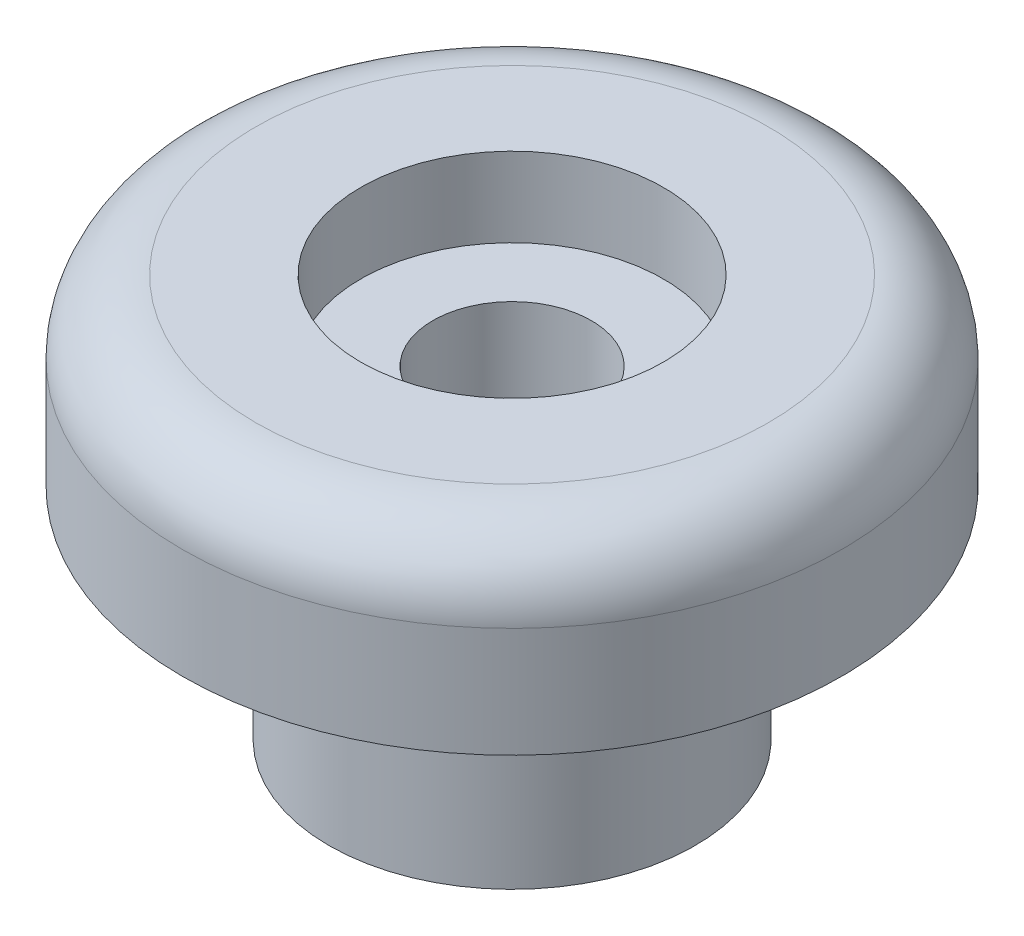
ISO-10303-21;
HEADER;
FILE_DESCRIPTION(('STEP AP214'),'2;1');
FILE_NAME('part.step','',(''),(''),'','','');
FILE_SCHEMA(('AUTOMOTIVE_DESIGN { 1 0 10303 214 1 1 1 1 }'));
ENDSEC;
DATA;
#1=APPLICATION_CONTEXT('core data for automotive mechanical design processes');
#2=APPLICATION_PROTOCOL_DEFINITION('international standard','automotive_design',2000,#1);
#3=PRODUCT_CONTEXT('',#1,'mechanical');
#4=PRODUCT('Part','Part','',(#3));
#5=PRODUCT_RELATED_PRODUCT_CATEGORY('part','',(#4));
#6=PRODUCT_DEFINITION_FORMATION('','',#4);
#7=PRODUCT_DEFINITION_CONTEXT('part definition',#1,'design');
#8=PRODUCT_DEFINITION('design','',#6,#7);
#9=PRODUCT_DEFINITION_SHAPE('','',#8);
#10=(LENGTH_UNIT() NAMED_UNIT(*) SI_UNIT(.MILLI.,.METRE.));
#11=(NAMED_UNIT(*) PLANE_ANGLE_UNIT() SI_UNIT($,.RADIAN.));
#12=(NAMED_UNIT(*) SI_UNIT($,.STERADIAN.) SOLID_ANGLE_UNIT());
#13=UNCERTAINTY_MEASURE_WITH_UNIT(LENGTH_MEASURE(1.E-05),#10,'distance_accuracy_value','');
#14=(GEOMETRIC_REPRESENTATION_CONTEXT(3) GLOBAL_UNCERTAINTY_ASSIGNED_CONTEXT((#13)) GLOBAL_UNIT_ASSIGNED_CONTEXT((#10,
#11,#12)) REPRESENTATION_CONTEXT('',''));
#15=CARTESIAN_POINT('',(0.,0.,0.));
#16=DIRECTION('',(0.,0.,1.));
#17=DIRECTION('',(1.,0.,0.));
#18=AXIS2_PLACEMENT_3D('',#15,#16,#17);
#19=CARTESIAN_POINT('',(0.,8.89,0.));
#20=DIRECTION('',(0.,-1.,0.));
#21=DIRECTION('',(0.,0.,-1.));
#22=AXIS2_PLACEMENT_3D('',#19,#20,#21);
#23=CYLINDRICAL_SURFACE('',#22,6.35);
#24=CARTESIAN_POINT('',(0.,0.,0.));
#25=DIRECTION('',(0.,1.,0.));
#26=DIRECTION('',(0.,0.,1.));
#27=AXIS2_PLACEMENT_3D('',#24,#25,#26);
#28=CIRCLE('',#27,6.35);
#29=CARTESIAN_POINT('',(0.,0.,6.35));
#30=VERTEX_POINT('',#29);
#31=EDGE_CURVE('E54',#30,#30,#28,.T.);
#32=ORIENTED_EDGE('',*,*,#31,.T.);
#33=EDGE_LOOP('',(#32));
#34=FACE_BOUND('',#33,.T.);
#35=CARTESIAN_POINT('',(0.,7.62,0.));
#36=DIRECTION('',(0.,1.,0.));
#37=DIRECTION('',(0.,0.,1.));
#38=AXIS2_PLACEMENT_3D('',#35,#36,#37);
#39=CIRCLE('',#38,6.35);
#40=CARTESIAN_POINT('',(0.,7.62,6.35));
#41=VERTEX_POINT('',#40);
#42=EDGE_CURVE('E50',#41,#41,#39,.T.);
#43=ORIENTED_EDGE('',*,*,#42,.F.);
#44=EDGE_LOOP('',(#43));
#45=FACE_BOUND('',#44,.T.);
#46=ADVANCED_FACE('F39',(#34,#45),#23,.T.);
#47=CARTESIAN_POINT('',(0.,0.,0.));
#48=DIRECTION('',(0.,1.,0.));
#49=DIRECTION('',(0.,0.,1.));
#50=AXIS2_PLACEMENT_3D('',#47,#48,#49);
#51=PLANE('',#50);
#52=CARTESIAN_POINT('',(0.,0.,0.));
#53=DIRECTION('',(0.,1.,0.));
#54=DIRECTION('',(0.,0.,1.));
#55=AXIS2_PLACEMENT_3D('',#52,#53,#54);
#56=CIRCLE('',#55,2.75);
#57=CARTESIAN_POINT('',(0.,0.,2.75));
#58=VERTEX_POINT('',#57);
#59=EDGE_CURVE('E62',#58,#58,#56,.T.);
#60=ORIENTED_EDGE('',*,*,#59,.T.);
#61=EDGE_LOOP('',(#60));
#62=FACE_BOUND('',#61,.T.);
#63=ORIENTED_EDGE('',*,*,#31,.F.);
#64=EDGE_LOOP('',(#63));
#65=FACE_BOUND('',#64,.T.);
#66=ADVANCED_FACE('F95',(#62,#65),#51,.F.);
#67=CARTESIAN_POINT('',(0.,7.62,0.));
#68=DIRECTION('',(0.,1.,0.));
#69=DIRECTION('',(0.,0.,1.));
#70=AXIS2_PLACEMENT_3D('',#67,#68,#69);
#71=CYLINDRICAL_SURFACE('',#70,11.43);
#72=CARTESIAN_POINT('',(0.,11.43,0.));
#73=DIRECTION('',(0.,1.,0.));
#74=DIRECTION('',(0.,0.,1.));
#75=AXIS2_PLACEMENT_3D('',#72,#73,#74);
#76=CIRCLE('',#75,11.43);
#77=CARTESIAN_POINT('',(0.,11.43,11.43));
#78=VERTEX_POINT('',#77);
#79=EDGE_CURVE('E10',#78,#78,#76,.F.);
#80=ORIENTED_EDGE('',*,*,#79,.T.);
#81=EDGE_LOOP('',(#80));
#82=FACE_BOUND('',#81,.T.);
#83=CARTESIAN_POINT('',(0.,7.62,0.));
#84=DIRECTION('',(0.,1.,0.));
#85=DIRECTION('',(0.,0.,1.));
#86=AXIS2_PLACEMENT_3D('',#83,#84,#85);
#87=CIRCLE('',#86,11.43);
#88=CARTESIAN_POINT('',(0.,7.62,11.43));
#89=VERTEX_POINT('',#88);
#90=EDGE_CURVE('E59',#89,#89,#87,.T.);
#91=ORIENTED_EDGE('',*,*,#90,.T.);
#92=EDGE_LOOP('',(#91));
#93=FACE_BOUND('',#92,.T.);
#94=ADVANCED_FACE('F91',(#82,#93),#71,.T.);
#95=CARTESIAN_POINT('',(0.,7.62,0.));
#96=DIRECTION('',(0.,1.,0.));
#97=DIRECTION('',(0.,0.,1.));
#98=AXIS2_PLACEMENT_3D('',#95,#96,#97);
#99=PLANE('',#98);
#100=ORIENTED_EDGE('',*,*,#42,.T.);
#101=EDGE_LOOP('',(#100));
#102=FACE_BOUND('',#101,.T.);
#103=ORIENTED_EDGE('',*,*,#90,.F.);
#104=EDGE_LOOP('',(#103));
#105=FACE_BOUND('',#104,.T.);
#106=ADVANCED_FACE('F80',(#102,#105),#99,.F.);
#107=CARTESIAN_POINT('',(0.,13.97,0.));
#108=DIRECTION('',(0.,1.,0.));
#109=DIRECTION('',(0.,0.,1.));
#110=AXIS2_PLACEMENT_3D('',#107,#108,#109);
#111=PLANE('',#110);
#112=CARTESIAN_POINT('',(0.,13.97,0.));
#113=DIRECTION('',(0.,1.,0.));
#114=DIRECTION('',(0.,0.,1.));
#115=AXIS2_PLACEMENT_3D('',#112,#113,#114);
#116=CIRCLE('',#115,8.89);
#117=CARTESIAN_POINT('',(0.,13.97,8.89));
#118=VERTEX_POINT('',#117);
#119=EDGE_CURVE('E46',#118,#118,#116,.T.);
#120=ORIENTED_EDGE('',*,*,#119,.T.);
#121=EDGE_LOOP('',(#120));
#122=FACE_BOUND('',#121,.T.);
#123=CARTESIAN_POINT('',(0.,13.97,0.));
#124=DIRECTION('',(0.,1.,0.));
#125=DIRECTION('',(0.,0.,1.));
#126=AXIS2_PLACEMENT_3D('',#123,#124,#125);
#127=CIRCLE('',#126,5.25);
#128=CARTESIAN_POINT('',(0.,13.97,5.25));
#129=VERTEX_POINT('',#128);
#130=EDGE_CURVE('E71',#129,#129,#127,.T.);
#131=ORIENTED_EDGE('',*,*,#130,.F.);
#132=EDGE_LOOP('',(#131));
#133=FACE_BOUND('',#132,.T.);
#134=ADVANCED_FACE('F77',(#122,#133),#111,.T.);
#135=CARTESIAN_POINT('',(0.,13.97,0.));
#136=DIRECTION('',(0.,1.,0.));
#137=DIRECTION('',(0.,0.,1.));
#138=AXIS2_PLACEMENT_3D('',#135,#136,#137);
#139=CYLINDRICAL_SURFACE('',#138,2.75);
#140=ORIENTED_EDGE('',*,*,#59,.F.);
#141=EDGE_LOOP('',(#140));
#142=FACE_BOUND('',#141,.T.);
#143=CARTESIAN_POINT('',(0.,11.22,0.));
#144=DIRECTION('',(0.,1.,0.));
#145=DIRECTION('',(0.,0.,1.));
#146=AXIS2_PLACEMENT_3D('',#143,#144,#145);
#147=CIRCLE('',#146,2.75);
#148=CARTESIAN_POINT('',(0.,11.22,2.75));
#149=VERTEX_POINT('',#148);
#150=EDGE_CURVE('E65',#149,#149,#147,.T.);
#151=ORIENTED_EDGE('',*,*,#150,.T.);
#152=EDGE_LOOP('',(#151));
#153=FACE_BOUND('',#152,.T.);
#154=ADVANCED_FACE('F79',(#142,#153),#139,.F.);
#155=CARTESIAN_POINT('',(2.75,11.22,0.));
#156=DIRECTION('',(0.,-1.,0.));
#157=DIRECTION('',(0.,0.,-1.));
#158=AXIS2_PLACEMENT_3D('',#155,#156,#157);
#159=PLANE('',#158);
#160=ORIENTED_EDGE('',*,*,#150,.F.);
#161=EDGE_LOOP('',(#160));
#162=FACE_BOUND('',#161,.T.);
#163=CARTESIAN_POINT('',(0.,11.22,0.));
#164=DIRECTION('',(0.,1.,0.));
#165=DIRECTION('',(0.,0.,1.));
#166=AXIS2_PLACEMENT_3D('',#163,#164,#165);
#167=CIRCLE('',#166,5.25);
#168=CARTESIAN_POINT('',(0.,11.22,5.25));
#169=VERTEX_POINT('',#168);
#170=EDGE_CURVE('E68',#169,#169,#167,.T.);
#171=ORIENTED_EDGE('',*,*,#170,.T.);
#172=EDGE_LOOP('',(#171));
#173=FACE_BOUND('',#172,.T.);
#174=ADVANCED_FACE('F87',(#162,#173),#159,.F.);
#175=CARTESIAN_POINT('',(0.,13.97,0.));
#176=DIRECTION('',(0.,1.,0.));
#177=DIRECTION('',(0.,0.,1.));
#178=AXIS2_PLACEMENT_3D('',#175,#176,#177);
#179=CYLINDRICAL_SURFACE('',#178,5.25);
#180=ORIENTED_EDGE('',*,*,#170,.F.);
#181=EDGE_LOOP('',(#180));
#182=FACE_BOUND('',#181,.T.);
#183=ORIENTED_EDGE('',*,*,#130,.T.);
#184=EDGE_LOOP('',(#183));
#185=FACE_BOUND('',#184,.T.);
#186=ADVANCED_FACE('F75',(#182,#185),#179,.F.);
#187=CARTESIAN_POINT('',(0.,11.43,0.));
#188=DIRECTION('',(0.,1.,0.));
#189=DIRECTION('',(0.,0.,1.));
#190=AXIS2_PLACEMENT_3D('',#187,#188,#189);
#191=TOROIDAL_SURFACE('',#190,8.89,2.54);
#192=ORIENTED_EDGE('',*,*,#79,.F.);
#193=EDGE_LOOP('',(#192));
#194=FACE_BOUND('',#193,.T.);
#195=ORIENTED_EDGE('',*,*,#119,.F.);
#196=EDGE_LOOP('',(#195));
#197=FACE_BOUND('',#196,.T.);
#198=ADVANCED_FACE('F41',(#194,#197),#191,.T.);
#199=CLOSED_SHELL('',(#46,#66,#94,#106,#134,#154,#174,#186,#198));
#200=MANIFOLD_SOLID_BREP('B2',#199);
#201=ADVANCED_BREP_SHAPE_REPRESENTATION('',(#18,#200),#14);
#202=SHAPE_DEFINITION_REPRESENTATION(#9,#201);
ENDSEC;
END-ISO-10303-21;
